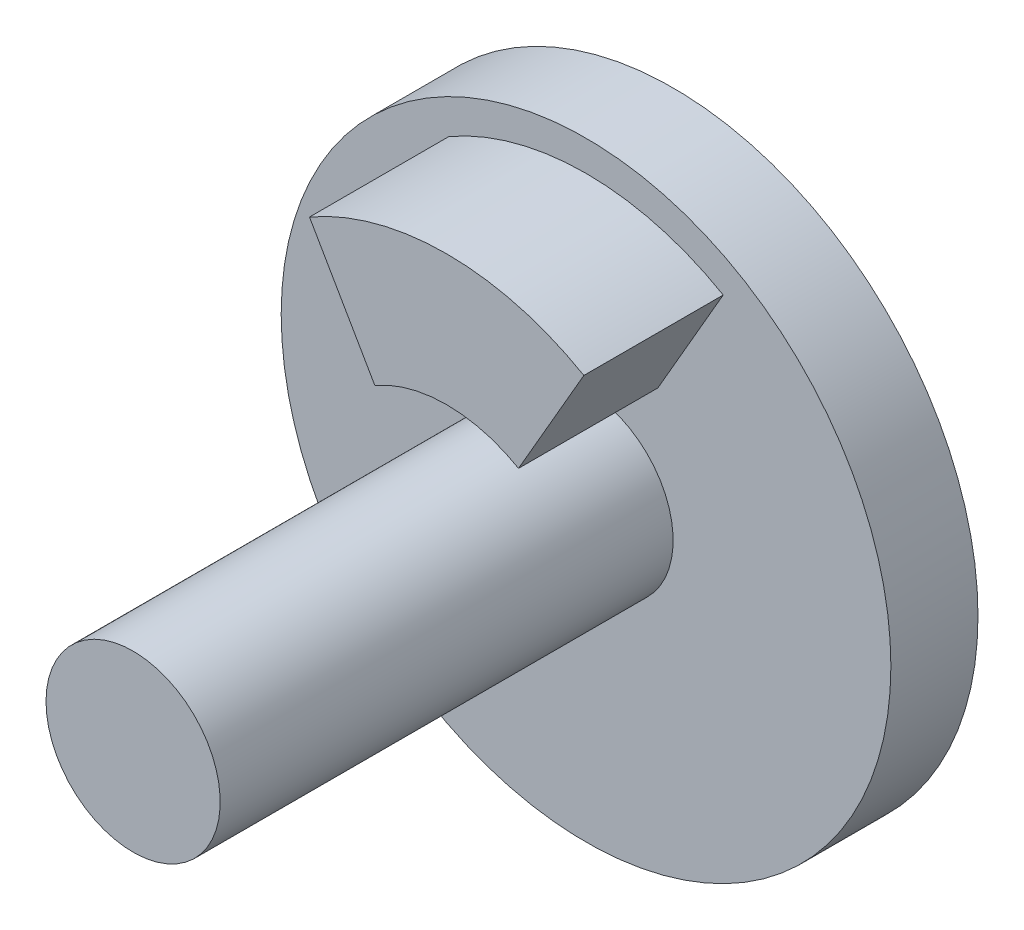
ISO-10303-21;
HEADER;
FILE_DESCRIPTION(('STEP AP214'),'2;1');
FILE_NAME('part.step','',(''),(''),'','','');
FILE_SCHEMA(('AUTOMOTIVE_DESIGN { 1 0 10303 214 1 1 1 1 }'));
ENDSEC;
DATA;
#1=APPLICATION_CONTEXT('core data for automotive mechanical design processes');
#2=APPLICATION_PROTOCOL_DEFINITION('international standard','automotive_design',2000,#1);
#3=PRODUCT_CONTEXT('',#1,'mechanical');
#4=PRODUCT('Part','Part','',(#3));
#5=PRODUCT_RELATED_PRODUCT_CATEGORY('part','',(#4));
#6=PRODUCT_DEFINITION_FORMATION('','',#4);
#7=PRODUCT_DEFINITION_CONTEXT('part definition',#1,'design');
#8=PRODUCT_DEFINITION('design','',#6,#7);
#9=PRODUCT_DEFINITION_SHAPE('','',#8);
#10=(LENGTH_UNIT() NAMED_UNIT(*) SI_UNIT(.MILLI.,.METRE.));
#11=(NAMED_UNIT(*) PLANE_ANGLE_UNIT() SI_UNIT($,.RADIAN.));
#12=(NAMED_UNIT(*) SI_UNIT($,.STERADIAN.) SOLID_ANGLE_UNIT());
#13=UNCERTAINTY_MEASURE_WITH_UNIT(LENGTH_MEASURE(1.E-05),#10,'distance_accuracy_value','');
#14=(GEOMETRIC_REPRESENTATION_CONTEXT(3) GLOBAL_UNCERTAINTY_ASSIGNED_CONTEXT((#13)) GLOBAL_UNIT_ASSIGNED_CONTEXT((#10,
#11,#12)) REPRESENTATION_CONTEXT('',''));
#15=CARTESIAN_POINT('',(0.,0.,0.));
#16=DIRECTION('',(0.,0.,1.));
#17=DIRECTION('',(1.,0.,0.));
#18=AXIS2_PLACEMENT_3D('',#15,#16,#17);
#19=CARTESIAN_POINT('',(0.,0.,2.5));
#20=DIRECTION('',(0.,0.,1.));
#21=DIRECTION('',(1.,0.,0.));
#22=AXIS2_PLACEMENT_3D('',#19,#20,#21);
#23=PLANE('',#22);
#24=CARTESIAN_POINT('',(0.,0.,2.5));
#25=DIRECTION('',(0.,0.,1.));
#26=DIRECTION('',(1.,0.,0.));
#27=AXIS2_PLACEMENT_3D('',#24,#25,#26);
#28=CIRCLE('',#27,5.);
#29=CARTESIAN_POINT('',(-5.,0.,2.5));
#30=VERTEX_POINT('',#29);
#31=EDGE_CURVE('E107',#30,#30,#28,.T.);
#32=ORIENTED_EDGE('',*,*,#31,.F.);
#33=EDGE_LOOP('',(#32));
#34=FACE_BOUND('',#33,.T.);
#35=CARTESIAN_POINT('',(0.,0.,2.5));
#36=DIRECTION('',(0.,0.,1.));
#37=DIRECTION('',(1.,0.,0.));
#38=AXIS2_PLACEMENT_3D('',#35,#36,#37);
#39=CIRCLE('',#38,17.5);
#40=CARTESIAN_POINT('',(17.5,0.,2.5));
#41=VERTEX_POINT('',#40);
#42=EDGE_CURVE('E11',#41,#41,#39,.T.);
#43=ORIENTED_EDGE('',*,*,#42,.T.);
#44=EDGE_LOOP('',(#43));
#45=FACE_BOUND('',#44,.T.);
#46=DIRECTION('',(0.499999999999996,-0.866025403784441,0.));
#47=VECTOR('',#46,1.);
#48=CARTESIAN_POINT('',(-4.12499999999996,7.14470958122165,2.5));
#49=LINE('',#48,#47);
#50=CARTESIAN_POINT('',(-7.87499999999993,13.639900109605,2.5));
#51=VERTEX_POINT('',#50);
#52=CARTESIAN_POINT('',(-4.12499999999996,7.14470958122165,2.5));
#53=VERTEX_POINT('',#52);
#54=EDGE_CURVE('E128',#51,#53,#49,.T.);
#55=ORIENTED_EDGE('',*,*,#54,.F.);
#56=CARTESIAN_POINT('',(0.,0.,2.5));
#57=DIRECTION('',(0.,0.,1.));
#58=DIRECTION('',(-1.,0.,0.));
#59=AXIS2_PLACEMENT_3D('',#56,#57,#58);
#60=CIRCLE('',#59,15.75);
#61=CARTESIAN_POINT('',(7.87499999999993,13.639900109605,2.5));
#62=VERTEX_POINT('',#61);
#63=EDGE_CURVE('E112',#62,#51,#60,.T.);
#64=ORIENTED_EDGE('',*,*,#63,.F.);
#65=DIRECTION('',(0.499999999999995,0.866025403784441,0.));
#66=VECTOR('',#65,1.);
#67=CARTESIAN_POINT('',(7.87499999999993,13.639900109605,2.5));
#68=LINE('',#67,#66);
#69=CARTESIAN_POINT('',(4.12499999999996,7.14470958122164,2.5));
#70=VERTEX_POINT('',#69);
#71=EDGE_CURVE('E119',#70,#62,#68,.T.);
#72=ORIENTED_EDGE('',*,*,#71,.F.);
#73=CARTESIAN_POINT('',(0.,0.,2.5));
#74=DIRECTION('',(0.,0.,-1.));
#75=DIRECTION('',(1.,0.,0.));
#76=AXIS2_PLACEMENT_3D('',#73,#74,#75);
#77=CIRCLE('',#76,8.25);
#78=EDGE_CURVE('E130',#53,#70,#77,.T.);
#79=ORIENTED_EDGE('',*,*,#78,.F.);
#80=EDGE_LOOP('',(#55,#64,#72,#79));
#81=FACE_BOUND('',#80,.T.);
#82=ADVANCED_FACE('F34',(#34,#45,#81),#23,.T.);
#83=CARTESIAN_POINT('',(0.,0.,2.5));
#84=DIRECTION('',(0.,0.,-1.));
#85=DIRECTION('',(-1.,0.,0.));
#86=AXIS2_PLACEMENT_3D('',#83,#84,#85);
#87=CYLINDRICAL_SURFACE('',#86,17.5);
#88=ORIENTED_EDGE('',*,*,#42,.F.);
#89=EDGE_LOOP('',(#88));
#90=FACE_BOUND('',#89,.T.);
#91=CARTESIAN_POINT('',(0.,0.,-2.5));
#92=DIRECTION('',(0.,0.,1.));
#93=DIRECTION('',(1.,0.,0.));
#94=AXIS2_PLACEMENT_3D('',#91,#92,#93);
#95=CIRCLE('',#94,17.5);
#96=CARTESIAN_POINT('',(17.5,0.,-2.5));
#97=VERTEX_POINT('',#96);
#98=EDGE_CURVE('E38',#97,#97,#95,.T.);
#99=ORIENTED_EDGE('',*,*,#98,.T.);
#100=EDGE_LOOP('',(#99));
#101=FACE_BOUND('',#100,.T.);
#102=ADVANCED_FACE('F36',(#90,#101),#87,.T.);
#103=CARTESIAN_POINT('',(0.,0.,-2.5));
#104=DIRECTION('',(0.,0.,1.));
#105=DIRECTION('',(1.,0.,0.));
#106=AXIS2_PLACEMENT_3D('',#103,#104,#105);
#107=PLANE('',#106);
#108=DIRECTION('',(1.,0.,0.));
#109=VECTOR('',#108,1.);
#110=CARTESIAN_POINT('',(2.23606797749979,2.,-2.5));
#111=LINE('',#110,#109);
#112=CARTESIAN_POINT('',(-2.23606797749979,2.,-2.5));
#113=VERTEX_POINT('',#112);
#114=CARTESIAN_POINT('',(2.23606797749979,2.,-2.5));
#115=VERTEX_POINT('',#114);
#116=EDGE_CURVE('E100',#113,#115,#111,.T.);
#117=ORIENTED_EDGE('',*,*,#116,.F.);
#118=CARTESIAN_POINT('',(0.,0.,-2.5));
#119=DIRECTION('',(0.,0.,-1.));
#120=DIRECTION('',(-1.,0.,0.));
#121=AXIS2_PLACEMENT_3D('',#118,#119,#120);
#122=CIRCLE('',#121,3.);
#123=EDGE_CURVE('E49',#115,#113,#122,.T.);
#124=ORIENTED_EDGE('',*,*,#123,.F.);
#125=EDGE_LOOP('',(#117,#124));
#126=FACE_BOUND('',#125,.T.);
#127=ORIENTED_EDGE('',*,*,#98,.F.);
#128=EDGE_LOOP('',(#127));
#129=FACE_BOUND('',#128,.T.);
#130=ADVANCED_FACE('F146',(#126,#129),#107,.F.);
#131=CARTESIAN_POINT('',(0.,0.,10.5));
#132=DIRECTION('',(0.,0.,-1.));
#133=DIRECTION('',(-1.,0.,0.));
#134=AXIS2_PLACEMENT_3D('',#131,#132,#133);
#135=CYLINDRICAL_SURFACE('',#134,15.75);
#136=ORIENTED_EDGE('',*,*,#63,.T.);
#137=DIRECTION('',(0.,0.,-1.));
#138=VECTOR('',#137,1.);
#139=CARTESIAN_POINT('',(-7.87499999999993,13.639900109605,10.5));
#140=LINE('',#139,#138);
#141=CARTESIAN_POINT('',(-7.87499999999993,13.639900109605,10.5));
#142=VERTEX_POINT('',#141);
#143=EDGE_CURVE('E139',#142,#51,#140,.T.);
#144=ORIENTED_EDGE('',*,*,#143,.F.);
#145=CARTESIAN_POINT('',(0.,0.,10.5));
#146=DIRECTION('',(0.,0.,1.));
#147=DIRECTION('',(-1.,0.,0.));
#148=AXIS2_PLACEMENT_3D('',#145,#146,#147);
#149=CIRCLE('',#148,15.75);
#150=CARTESIAN_POINT('',(7.87499999999993,13.639900109605,10.5));
#151=VERTEX_POINT('',#150);
#152=EDGE_CURVE('E115',#151,#142,#149,.T.);
#153=ORIENTED_EDGE('',*,*,#152,.F.);
#154=DIRECTION('',(0.,0.,-1.));
#155=VECTOR('',#154,1.);
#156=CARTESIAN_POINT('',(7.87499999999993,13.639900109605,10.5));
#157=LINE('',#156,#155);
#158=EDGE_CURVE('E125',#151,#62,#157,.T.);
#159=ORIENTED_EDGE('',*,*,#158,.T.);
#160=EDGE_LOOP('',(#136,#144,#153,#159));
#161=FACE_BOUND('',#160,.T.);
#162=ADVANCED_FACE('F148',(#161),#135,.T.);
#163=CARTESIAN_POINT('',(-4.12499999999996,7.14470958122165,10.5));
#164=DIRECTION('',(0.866025403784441,0.499999999999996,0.));
#165=DIRECTION('',(-0.499999999999996,0.866025403784441,0.));
#166=AXIS2_PLACEMENT_3D('',#163,#164,#165);
#167=PLANE('',#166);
#168=ORIENTED_EDGE('',*,*,#54,.T.);
#169=DIRECTION('',(0.,0.,-1.));
#170=VECTOR('',#169,1.);
#171=CARTESIAN_POINT('',(-4.12499999999996,7.14470958122165,10.5));
#172=LINE('',#171,#170);
#173=CARTESIAN_POINT('',(-4.12499999999996,7.14470958122165,10.5));
#174=VERTEX_POINT('',#173);
#175=EDGE_CURVE('E136',#174,#53,#172,.T.);
#176=ORIENTED_EDGE('',*,*,#175,.F.);
#177=DIRECTION('',(0.499999999999996,-0.866025403784441,0.));
#178=VECTOR('',#177,1.);
#179=CARTESIAN_POINT('',(-4.12499999999996,7.14470958122165,10.5));
#180=LINE('',#179,#178);
#181=EDGE_CURVE('E118',#142,#174,#180,.T.);
#182=ORIENTED_EDGE('',*,*,#181,.F.);
#183=ORIENTED_EDGE('',*,*,#143,.T.);
#184=EDGE_LOOP('',(#168,#176,#182,#183));
#185=FACE_BOUND('',#184,.T.);
#186=ADVANCED_FACE('F154',(#185),#167,.F.);
#187=CARTESIAN_POINT('',(0.,0.,10.5));
#188=DIRECTION('',(0.,0.,-1.));
#189=DIRECTION('',(-1.,0.,0.));
#190=AXIS2_PLACEMENT_3D('',#187,#188,#189);
#191=CYLINDRICAL_SURFACE('',#190,8.25);
#192=ORIENTED_EDGE('',*,*,#78,.T.);
#193=DIRECTION('',(0.,0.,-1.));
#194=VECTOR('',#193,1.);
#195=CARTESIAN_POINT('',(4.12499999999996,7.14470958122164,10.5));
#196=LINE('',#195,#194);
#197=CARTESIAN_POINT('',(4.12499999999996,7.14470958122164,10.5));
#198=VERTEX_POINT('',#197);
#199=EDGE_CURVE('E57',#198,#70,#196,.T.);
#200=ORIENTED_EDGE('',*,*,#199,.F.);
#201=CARTESIAN_POINT('',(0.,0.,10.5));
#202=DIRECTION('',(0.,0.,-1.));
#203=DIRECTION('',(1.,0.,0.));
#204=AXIS2_PLACEMENT_3D('',#201,#202,#203);
#205=CIRCLE('',#204,8.25);
#206=EDGE_CURVE('E121',#174,#198,#205,.T.);
#207=ORIENTED_EDGE('',*,*,#206,.F.);
#208=ORIENTED_EDGE('',*,*,#175,.T.);
#209=EDGE_LOOP('',(#192,#200,#207,#208));
#210=FACE_BOUND('',#209,.T.);
#211=ADVANCED_FACE('F168',(#210),#191,.F.);
#212=CARTESIAN_POINT('',(7.87499999999993,13.639900109605,10.5));
#213=DIRECTION('',(-0.866025403784441,0.499999999999995,0.));
#214=DIRECTION('',(-0.499999999999995,-0.866025403784441,0.));
#215=AXIS2_PLACEMENT_3D('',#212,#213,#214);
#216=PLANE('',#215);
#217=ORIENTED_EDGE('',*,*,#71,.T.);
#218=ORIENTED_EDGE('',*,*,#158,.F.);
#219=DIRECTION('',(0.499999999999995,0.866025403784441,0.));
#220=VECTOR('',#219,1.);
#221=CARTESIAN_POINT('',(7.87499999999993,13.639900109605,10.5));
#222=LINE('',#221,#220);
#223=EDGE_CURVE('E123',#198,#151,#222,.T.);
#224=ORIENTED_EDGE('',*,*,#223,.F.);
#225=ORIENTED_EDGE('',*,*,#199,.T.);
#226=EDGE_LOOP('',(#217,#218,#224,#225));
#227=FACE_BOUND('',#226,.T.);
#228=ADVANCED_FACE('F171',(#227),#216,.F.);
#229=CARTESIAN_POINT('',(0.,0.,10.5));
#230=DIRECTION('',(0.,0.,-1.));
#231=DIRECTION('',(-1.,0.,0.));
#232=AXIS2_PLACEMENT_3D('',#229,#230,#231);
#233=PLANE('',#232);
#234=ORIENTED_EDGE('',*,*,#152,.T.);
#235=ORIENTED_EDGE('',*,*,#181,.T.);
#236=ORIENTED_EDGE('',*,*,#206,.T.);
#237=ORIENTED_EDGE('',*,*,#223,.T.);
#238=EDGE_LOOP('',(#234,#235,#236,#237));
#239=FACE_BOUND('',#238,.T.);
#240=ADVANCED_FACE('F175',(#239),#233,.F.);
#241=CARTESIAN_POINT('',(0.,0.,28.5));
#242=DIRECTION('',(0.,0.,-1.));
#243=DIRECTION('',(-1.,0.,0.));
#244=AXIS2_PLACEMENT_3D('',#241,#242,#243);
#245=CYLINDRICAL_SURFACE('',#244,5.);
#246=CARTESIAN_POINT('',(0.,0.,28.5));
#247=DIRECTION('',(0.,0.,1.));
#248=DIRECTION('',(1.,0.,0.));
#249=AXIS2_PLACEMENT_3D('',#246,#247,#248);
#250=CIRCLE('',#249,5.);
#251=CARTESIAN_POINT('',(-5.,0.,28.5));
#252=VERTEX_POINT('',#251);
#253=EDGE_CURVE('E109',#252,#252,#250,.T.);
#254=CARTESIAN_POINT('',(-5.,0.,28.5));
#255=CARTESIAN_POINT('',(-5.,0.,28.2291666666667));
#256=CARTESIAN_POINT('',(-5.,0.,27.9583333333333));
#257=CARTESIAN_POINT('',(-5.,0.,27.4166666666667));
#258=CARTESIAN_POINT('',(-5.,0.,27.1458333333333));
#259=CARTESIAN_POINT('',(-5.,0.,26.6041666666667));
#260=CARTESIAN_POINT('',(-5.,0.,26.3333333333333));
#261=CARTESIAN_POINT('',(-5.,0.,25.7916666666667));
#262=CARTESIAN_POINT('',(-5.,0.,25.5208333333333));
#263=CARTESIAN_POINT('',(-5.,0.,24.9791666666667));
#264=CARTESIAN_POINT('',(-5.,0.,24.7083333333333));
#265=CARTESIAN_POINT('',(-5.,0.,24.1666666666667));
#266=CARTESIAN_POINT('',(-5.,0.,23.8958333333333));
#267=CARTESIAN_POINT('',(-5.,0.,23.3541666666667));
#268=CARTESIAN_POINT('',(-5.,0.,23.0833333333333));
#269=CARTESIAN_POINT('',(-5.,0.,22.5416666666667));
#270=CARTESIAN_POINT('',(-5.,0.,22.2708333333333));
#271=CARTESIAN_POINT('',(-5.,0.,21.7291666666667));
#272=CARTESIAN_POINT('',(-5.,0.,21.4583333333333));
#273=CARTESIAN_POINT('',(-5.,0.,20.9166666666667));
#274=CARTESIAN_POINT('',(-5.,0.,20.6458333333333));
#275=CARTESIAN_POINT('',(-5.,0.,20.1041666666667));
#276=CARTESIAN_POINT('',(-5.,0.,19.8333333333333));
#277=CARTESIAN_POINT('',(-5.,0.,19.2916666666667));
#278=CARTESIAN_POINT('',(-5.,0.,19.0208333333333));
#279=CARTESIAN_POINT('',(-5.,0.,18.4791666666667));
#280=CARTESIAN_POINT('',(-5.,0.,18.2083333333333));
#281=CARTESIAN_POINT('',(-5.,0.,17.6666666666667));
#282=CARTESIAN_POINT('',(-5.,0.,17.3958333333333));
#283=CARTESIAN_POINT('',(-5.,0.,16.8541666666667));
#284=CARTESIAN_POINT('',(-5.,0.,16.5833333333333));
#285=CARTESIAN_POINT('',(-5.,0.,16.0416666666667));
#286=CARTESIAN_POINT('',(-5.,0.,15.7708333333333));
#287=CARTESIAN_POINT('',(-5.,0.,15.2291666666667));
#288=CARTESIAN_POINT('',(-5.,0.,14.9583333333333));
#289=CARTESIAN_POINT('',(-5.,0.,14.4166666666667));
#290=CARTESIAN_POINT('',(-5.,0.,14.1458333333333));
#291=CARTESIAN_POINT('',(-5.,0.,13.6041666666667));
#292=CARTESIAN_POINT('',(-5.,0.,13.3333333333333));
#293=CARTESIAN_POINT('',(-5.,0.,12.7916666666667));
#294=CARTESIAN_POINT('',(-5.,0.,12.5208333333333));
#295=CARTESIAN_POINT('',(-5.,0.,11.9791666666667));
#296=CARTESIAN_POINT('',(-5.,0.,11.7083333333333));
#297=CARTESIAN_POINT('',(-5.,0.,11.1666666666667));
#298=CARTESIAN_POINT('',(-5.,0.,10.8958333333333));
#299=CARTESIAN_POINT('',(-5.,0.,10.3541666666667));
#300=CARTESIAN_POINT('',(-5.,0.,10.0833333333333));
#301=CARTESIAN_POINT('',(-5.,0.,9.54166666666667));
#302=CARTESIAN_POINT('',(-5.,0.,9.27083333333333));
#303=CARTESIAN_POINT('',(-5.,0.,8.72916666666666));
#304=CARTESIAN_POINT('',(-5.,0.,8.45833333333333));
#305=CARTESIAN_POINT('',(-5.,0.,7.91666666666666));
#306=CARTESIAN_POINT('',(-5.,0.,7.64583333333333));
#307=CARTESIAN_POINT('',(-5.,0.,7.10416666666667));
#308=CARTESIAN_POINT('',(-5.,0.,6.83333333333333));
#309=CARTESIAN_POINT('',(-5.,0.,6.29166666666667));
#310=CARTESIAN_POINT('',(-5.,0.,6.02083333333333));
#311=CARTESIAN_POINT('',(-5.,0.,5.47916666666666));
#312=CARTESIAN_POINT('',(-5.,0.,5.20833333333333));
#313=CARTESIAN_POINT('',(-5.,0.,4.66666666666667));
#314=CARTESIAN_POINT('',(-5.,0.,4.39583333333333));
#315=CARTESIAN_POINT('',(-5.,0.,3.85416666666667));
#316=CARTESIAN_POINT('',(-5.,0.,3.58333333333333));
#317=CARTESIAN_POINT('',(-5.,0.,3.04166666666667));
#318=CARTESIAN_POINT('',(-5.,0.,2.77083333333333));
#319=CARTESIAN_POINT('',(-5.,0.,2.5));
#320=B_SPLINE_CURVE_WITH_KNOTS('',3,(#254,#255,#256,#257,#258,#259,#260,#261,#262,#263,#264,
#265,#266,#267,#268,#269,#270,#271,#272,#273,#274,#275,#276,#277,#278,#279,#280,#281,#282,#283,
#284,#285,#286,#287,#288,#289,#290,#291,#292,#293,#294,#295,#296,#297,#298,#299,#300,#301,#302,
#303,#304,#305,#306,#307,#308,#309,#310,#311,#312,#313,#314,#315,#316,#317,#318,#319),
.UNSPECIFIED.,.F.,.F.,(4,2,2,2,2,2,2,2,2,2,2,2,2,2,2,2,2,2,2,2,2,2,2,2,2,2,2,2,2,2,2,2,4),(0.,
0.812499999999997,1.625,2.4375,3.25,4.0625,4.875,5.6875,6.5,7.3125,8.125,8.9375,9.75,10.5625,
11.375,12.1875,13.,13.8125,14.625,15.4375,16.25,17.0625,17.875,18.6875,19.5,20.3125,21.125,
21.9375,22.75,23.5625,24.375,25.1875,26.),.UNSPECIFIED.);
#321=EDGE_CURVE('BSEAM178',#252,#30,#320,.T.);
#322=ORIENTED_EDGE('',*,*,#253,.F.);
#323=ORIENTED_EDGE('',*,*,#31,.T.);
#324=ORIENTED_EDGE('',*,*,#321,.T.);
#325=ORIENTED_EDGE('',*,*,#321,.F.);
#326=EDGE_LOOP('',(#322,#324,#323,#325));
#327=FACE_BOUND('',#326,.T.);
#328=ADVANCED_FACE('F178',(#327),#245,.T.);
#329=CARTESIAN_POINT('',(0.,0.,28.5));
#330=DIRECTION('',(0.,0.,1.));
#331=DIRECTION('',(1.,0.,0.));
#332=AXIS2_PLACEMENT_3D('',#329,#330,#331);
#333=PLANE('',#332);
#334=ORIENTED_EDGE('',*,*,#253,.T.);
#335=EDGE_LOOP('',(#334));
#336=FACE_BOUND('',#335,.T.);
#337=ADVANCED_FACE('F182',(#336),#333,.T.);
#338=CARTESIAN_POINT('',(0.,0.,7.5));
#339=DIRECTION('',(0.,0.,-1.));
#340=DIRECTION('',(-1.,0.,0.));
#341=AXIS2_PLACEMENT_3D('',#338,#339,#340);
#342=CYLINDRICAL_SURFACE('',#341,3.);
#343=ORIENTED_EDGE('',*,*,#123,.T.);
#344=DIRECTION('',(0.,0.,-1.));
#345=VECTOR('',#344,1.);
#346=CARTESIAN_POINT('',(-2.23606797749979,2.,7.5));
#347=LINE('',#346,#345);
#348=CARTESIAN_POINT('',(-2.23606797749979,2.,7.5));
#349=VERTEX_POINT('',#348);
#350=EDGE_CURVE('E86',#349,#113,#347,.T.);
#351=ORIENTED_EDGE('',*,*,#350,.F.);
#352=CARTESIAN_POINT('',(0.,0.,7.5));
#353=DIRECTION('',(0.,0.,-1.));
#354=DIRECTION('',(-1.,0.,0.));
#355=AXIS2_PLACEMENT_3D('',#352,#353,#354);
#356=CIRCLE('',#355,3.);
#357=CARTESIAN_POINT('',(2.23606797749979,2.,7.5));
#358=VERTEX_POINT('',#357);
#359=EDGE_CURVE('E89',#358,#349,#356,.T.);
#360=ORIENTED_EDGE('',*,*,#359,.F.);
#361=DIRECTION('',(0.,0.,-1.));
#362=VECTOR('',#361,1.);
#363=CARTESIAN_POINT('',(2.23606797749979,2.,7.5));
#364=LINE('',#363,#362);
#365=EDGE_CURVE('E95',#358,#115,#364,.T.);
#366=ORIENTED_EDGE('',*,*,#365,.T.);
#367=EDGE_LOOP('',(#343,#351,#360,#366));
#368=FACE_BOUND('',#367,.T.);
#369=ADVANCED_FACE('F88',(#368),#342,.F.);
#370=CARTESIAN_POINT('',(2.23606797749979,2.,7.5));
#371=DIRECTION('',(0.,1.,0.));
#372=DIRECTION('',(0.,0.,1.));
#373=AXIS2_PLACEMENT_3D('',#370,#371,#372);
#374=PLANE('',#373);
#375=ORIENTED_EDGE('',*,*,#116,.T.);
#376=ORIENTED_EDGE('',*,*,#365,.F.);
#377=DIRECTION('',(1.,0.,0.));
#378=VECTOR('',#377,1.);
#379=CARTESIAN_POINT('',(2.23606797749979,2.,7.5));
#380=LINE('',#379,#378);
#381=EDGE_CURVE('E96',#349,#358,#380,.T.);
#382=ORIENTED_EDGE('',*,*,#381,.F.);
#383=ORIENTED_EDGE('',*,*,#350,.T.);
#384=EDGE_LOOP('',(#375,#376,#382,#383));
#385=FACE_BOUND('',#384,.T.);
#386=ADVANCED_FACE('F102',(#385),#374,.F.);
#387=CARTESIAN_POINT('',(0.,0.,7.5));
#388=DIRECTION('',(0.,0.,-1.));
#389=DIRECTION('',(-1.,0.,0.));
#390=AXIS2_PLACEMENT_3D('',#387,#388,#389);
#391=PLANE('',#390);
#392=ORIENTED_EDGE('',*,*,#359,.T.);
#393=ORIENTED_EDGE('',*,*,#381,.T.);
#394=EDGE_LOOP('',(#392,#393));
#395=FACE_BOUND('',#394,.T.);
#396=ADVANCED_FACE('F99',(#395),#391,.T.);
#397=CLOSED_SHELL('',(#82,#102,#130,#162,#186,#211,#228,#240,#328,#337,#369,#386,#396));
#398=MANIFOLD_SOLID_BREP('B2',#397);
#399=ADVANCED_BREP_SHAPE_REPRESENTATION('',(#18,#398),#14);
#400=SHAPE_DEFINITION_REPRESENTATION(#9,#399);
ENDSEC;
END-ISO-10303-21;
